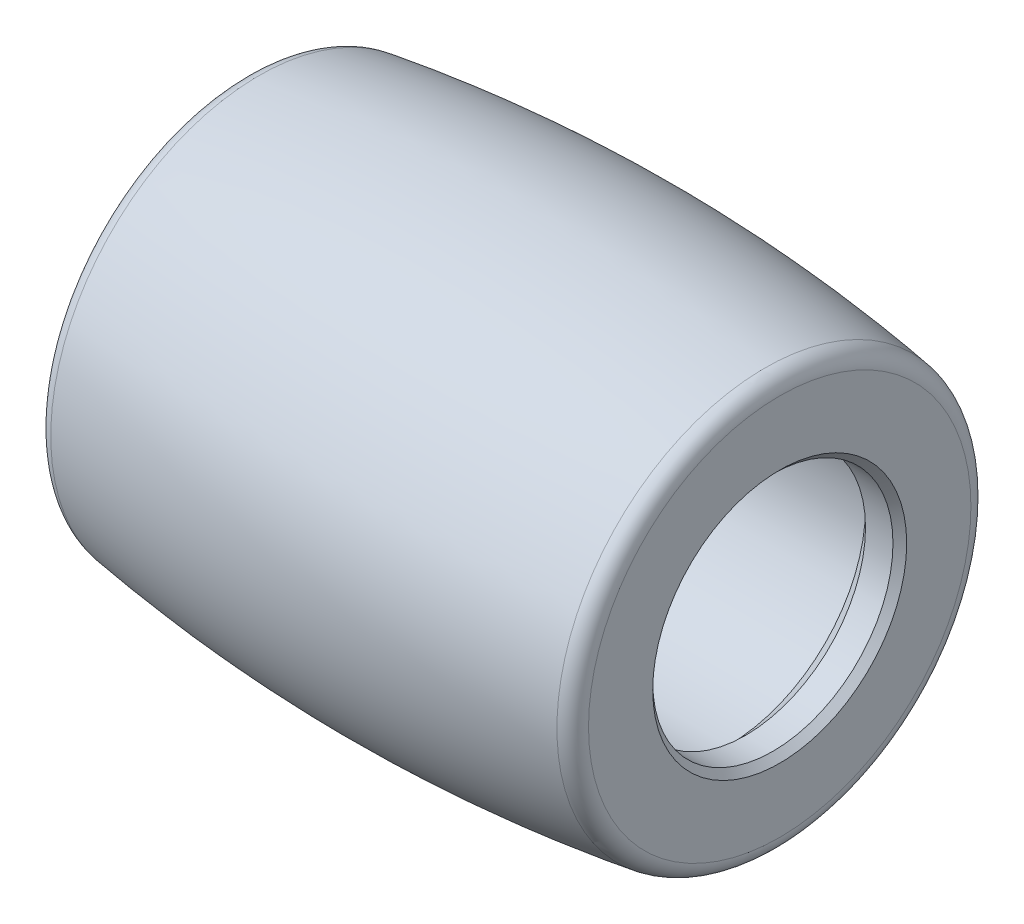
ISO-10303-21;
HEADER;
FILE_DESCRIPTION(('STEP AP214'),'2;1');
FILE_NAME('part.step','',(''),(''),'','','');
FILE_SCHEMA(('AUTOMOTIVE_DESIGN { 1 0 10303 214 1 1 1 1 }'));
ENDSEC;
DATA;
#1=APPLICATION_CONTEXT('core data for automotive mechanical design processes');
#2=APPLICATION_PROTOCOL_DEFINITION('international standard','automotive_design',2000,#1);
#3=PRODUCT_CONTEXT('',#1,'mechanical');
#4=PRODUCT('Part','Part','',(#3));
#5=PRODUCT_RELATED_PRODUCT_CATEGORY('part','',(#4));
#6=PRODUCT_DEFINITION_FORMATION('','',#4);
#7=PRODUCT_DEFINITION_CONTEXT('part definition',#1,'design');
#8=PRODUCT_DEFINITION('design','',#6,#7);
#9=PRODUCT_DEFINITION_SHAPE('','',#8);
#10=(LENGTH_UNIT() NAMED_UNIT(*) SI_UNIT(.MILLI.,.METRE.));
#11=(NAMED_UNIT(*) PLANE_ANGLE_UNIT() SI_UNIT($,.RADIAN.));
#12=(NAMED_UNIT(*) SI_UNIT($,.STERADIAN.) SOLID_ANGLE_UNIT());
#13=UNCERTAINTY_MEASURE_WITH_UNIT(LENGTH_MEASURE(1.E-05),#10,'distance_accuracy_value','');
#14=(GEOMETRIC_REPRESENTATION_CONTEXT(3) GLOBAL_UNCERTAINTY_ASSIGNED_CONTEXT((#13)) GLOBAL_UNIT_ASSIGNED_CONTEXT((#10,
#11,#12)) REPRESENTATION_CONTEXT('',''));
#15=CARTESIAN_POINT('',(0.,0.,0.));
#16=DIRECTION('',(0.,0.,1.));
#17=DIRECTION('',(1.,0.,0.));
#18=AXIS2_PLACEMENT_3D('',#15,#16,#17);
#19=CARTESIAN_POINT('',(-7.8,0.,0.));
#20=DIRECTION('',(-1.,0.,0.));
#21=DIRECTION('',(0.,0.,1.));
#22=AXIS2_PLACEMENT_3D('',#19,#20,#21);
#23=CYLINDRICAL_SURFACE('',#22,4.);
#24=CARTESIAN_POINT('',(6.29999999995334,0.,0.));
#25=DIRECTION('',(-1.,0.,0.));
#26=DIRECTION('',(0.,0.,1.));
#27=AXIS2_PLACEMENT_3D('',#24,#25,#26);
#28=CIRCLE('',#27,3.99999999996226);
#29=CARTESIAN_POINT('',(6.29999999995334,0.,3.99999999996226));
#30=VERTEX_POINT('',#29);
#31=EDGE_CURVE('E85',#30,#30,#28,.F.);
#32=ORIENTED_EDGE('',*,*,#31,.T.);
#33=EDGE_LOOP('',(#32));
#34=FACE_BOUND('',#33,.T.);
#35=CARTESIAN_POINT('',(-6.29999999995334,0.,0.));
#36=DIRECTION('',(1.,0.,0.));
#37=DIRECTION('',(0.,0.,-1.));
#38=AXIS2_PLACEMENT_3D('',#35,#36,#37);
#39=CIRCLE('',#38,3.99999999996226);
#40=CARTESIAN_POINT('',(-6.29999999995334,0.,-3.99999999996226));
#41=VERTEX_POINT('',#40);
#42=EDGE_CURVE('E58',#41,#41,#39,.F.);
#43=ORIENTED_EDGE('',*,*,#42,.T.);
#44=EDGE_LOOP('',(#43));
#45=FACE_BOUND('',#44,.T.);
#46=ADVANCED_FACE('F16',(#34,#45),#23,.F.);
#47=CARTESIAN_POINT('',(-6.29999999995334,0.,0.));
#48=DIRECTION('',(1.,0.,0.));
#49=DIRECTION('',(0.,0.,-1.));
#50=AXIS2_PLACEMENT_3D('',#47,#48,#49);
#51=CONICAL_SURFACE('',#50,3.99999999996226,0.785398163340605);
#52=CARTESIAN_POINT('',(-6.8,0.,0.));
#53=DIRECTION('',(1.,0.,0.));
#54=DIRECTION('',(0.,0.,-1.));
#55=AXIS2_PLACEMENT_3D('',#52,#53,#54);
#56=CIRCLE('',#55,3.5);
#57=CARTESIAN_POINT('',(-6.8,0.,-3.5));
#58=VERTEX_POINT('',#57);
#59=EDGE_CURVE('E82',#58,#58,#56,.F.);
#60=ORIENTED_EDGE('',*,*,#59,.T.);
#61=EDGE_LOOP('',(#60));
#62=FACE_BOUND('',#61,.T.);
#63=ORIENTED_EDGE('',*,*,#42,.F.);
#64=EDGE_LOOP('',(#63));
#65=FACE_BOUND('',#64,.T.);
#66=ADVANCED_FACE('F95',(#62,#65),#51,.F.);
#67=CARTESIAN_POINT('',(6.29999999995334,0.,0.));
#68=DIRECTION('',(-1.,0.,0.));
#69=DIRECTION('',(0.,0.,1.));
#70=AXIS2_PLACEMENT_3D('',#67,#68,#69);
#71=CONICAL_SURFACE('',#70,3.99999999996226,0.785398163340605);
#72=CARTESIAN_POINT('',(6.8,0.,0.));
#73=DIRECTION('',(1.,0.,0.));
#74=DIRECTION('',(0.,0.,-1.));
#75=AXIS2_PLACEMENT_3D('',#72,#73,#74);
#76=CIRCLE('',#75,3.5);
#77=CARTESIAN_POINT('',(6.8,0.,-3.5));
#78=VERTEX_POINT('',#77);
#79=EDGE_CURVE('E75',#78,#78,#76,.T.);
#80=ORIENTED_EDGE('',*,*,#79,.T.);
#81=EDGE_LOOP('',(#80));
#82=FACE_BOUND('',#81,.T.);
#83=ORIENTED_EDGE('',*,*,#31,.F.);
#84=EDGE_LOOP('',(#83));
#85=FACE_BOUND('',#84,.T.);
#86=ADVANCED_FACE('F97',(#82,#85),#71,.F.);
#87=CARTESIAN_POINT('',(-7.8,0.,0.));
#88=DIRECTION('',(1.,0.,0.));
#89=DIRECTION('',(0.,0.,-1.));
#90=AXIS2_PLACEMENT_3D('',#87,#88,#89);
#91=CYLINDRICAL_SURFACE('',#90,3.5);
#92=CARTESIAN_POINT('',(-7.60000000002492,0.,0.));
#93=DIRECTION('',(-1.,0.,0.));
#94=DIRECTION('',(0.,0.,1.));
#95=AXIS2_PLACEMENT_3D('',#92,#93,#94);
#96=CIRCLE('',#95,3.50000000003092);
#97=CARTESIAN_POINT('',(-7.60000000002492,0.,3.50000000003092));
#98=VERTEX_POINT('',#97);
#99=EDGE_CURVE('E70',#98,#98,#96,.T.);
#100=ORIENTED_EDGE('',*,*,#99,.T.);
#101=EDGE_LOOP('',(#100));
#102=FACE_BOUND('',#101,.T.);
#103=ORIENTED_EDGE('',*,*,#59,.F.);
#104=EDGE_LOOP('',(#103));
#105=FACE_BOUND('',#104,.T.);
#106=ADVANCED_FACE('F105',(#102,#105),#91,.F.);
#107=CARTESIAN_POINT('',(7.8,0.,0.));
#108=DIRECTION('',(1.,0.,0.));
#109=DIRECTION('',(0.,0.,-1.));
#110=AXIS2_PLACEMENT_3D('',#107,#108,#109);
#111=CYLINDRICAL_SURFACE('',#110,3.5);
#112=ORIENTED_EDGE('',*,*,#79,.F.);
#113=EDGE_LOOP('',(#112));
#114=FACE_BOUND('',#113,.T.);
#115=CARTESIAN_POINT('',(7.60000000002492,0.,0.));
#116=DIRECTION('',(1.,0.,0.));
#117=DIRECTION('',(0.,0.,-1.));
#118=AXIS2_PLACEMENT_3D('',#115,#116,#117);
#119=CIRCLE('',#118,3.50000000003092);
#120=CARTESIAN_POINT('',(7.60000000002492,0.,-3.50000000003092));
#121=VERTEX_POINT('',#120);
#122=EDGE_CURVE('E65',#121,#121,#119,.T.);
#123=ORIENTED_EDGE('',*,*,#122,.T.);
#124=EDGE_LOOP('',(#123));
#125=FACE_BOUND('',#124,.T.);
#126=ADVANCED_FACE('F136',(#114,#125),#111,.F.);
#127=CARTESIAN_POINT('',(-7.79999999991787,0.,0.));
#128=DIRECTION('',(-1.,0.,0.));
#129=DIRECTION('',(0.,0.,1.));
#130=AXIS2_PLACEMENT_3D('',#127,#128,#129);
#131=CONICAL_SURFACE('',#130,3.69999999992388,0.785398163397448);
#132=ORIENTED_EDGE('',*,*,#99,.F.);
#133=EDGE_LOOP('',(#132));
#134=FACE_BOUND('',#133,.T.);
#135=CARTESIAN_POINT('',(-7.79999999997472,0.,0.));
#136=DIRECTION('',(-1.,0.,0.));
#137=DIRECTION('',(0.,0.,1.));
#138=AXIS2_PLACEMENT_3D('',#135,#136,#137);
#139=CIRCLE('',#138,3.69999999998072);
#140=CARTESIAN_POINT('',(-7.79999999997472,0.,3.69999999998072));
#141=VERTEX_POINT('',#140);
#142=EDGE_CURVE('E20',#141,#141,#139,.T.);
#143=ORIENTED_EDGE('',*,*,#142,.T.);
#144=EDGE_LOOP('',(#143));
#145=FACE_BOUND('',#144,.T.);
#146=ADVANCED_FACE('F132',(#134,#145),#131,.F.);
#147=CARTESIAN_POINT('',(7.79999999991787,0.,0.));
#148=DIRECTION('',(1.,0.,0.));
#149=DIRECTION('',(0.,0.,-1.));
#150=AXIS2_PLACEMENT_3D('',#147,#148,#149);
#151=CONICAL_SURFACE('',#150,3.69999999992388,0.785398163397448);
#152=ORIENTED_EDGE('',*,*,#122,.F.);
#153=EDGE_LOOP('',(#152));
#154=FACE_BOUND('',#153,.T.);
#155=CARTESIAN_POINT('',(7.79999999997472,0.,0.));
#156=DIRECTION('',(1.,0.,0.));
#157=DIRECTION('',(0.,0.,-1.));
#158=AXIS2_PLACEMENT_3D('',#155,#156,#157);
#159=CIRCLE('',#158,3.69999999998072);
#160=CARTESIAN_POINT('',(7.79999999997472,0.,-3.69999999998072));
#161=VERTEX_POINT('',#160);
#162=EDGE_CURVE('E42',#161,#161,#159,.F.);
#163=ORIENTED_EDGE('',*,*,#162,.F.);
#164=EDGE_LOOP('',(#163));
#165=FACE_BOUND('',#164,.T.);
#166=ADVANCED_FACE('F128',(#154,#165),#151,.F.);
#167=CARTESIAN_POINT('',(-7.8,0.,0.));
#168=DIRECTION('',(1.,0.,0.));
#169=DIRECTION('',(0.,0.,-1.));
#170=AXIS2_PLACEMENT_3D('',#167,#168,#169);
#171=PLANE('',#170);
#172=CARTESIAN_POINT('',(-7.79999999999449,0.,0.));
#173=DIRECTION('',(1.,0.,0.));
#174=DIRECTION('',(0.,0.,-1.));
#175=AXIS2_PLACEMENT_3D('',#172,#173,#174);
#176=CIRCLE('',#175,5.57090774301135);
#177=CARTESIAN_POINT('',(-7.7999999999945,0.,-5.57090774301135));
#178=VERTEX_POINT('',#177);
#179=EDGE_CURVE('E41',#178,#178,#176,.T.);
#180=ORIENTED_EDGE('',*,*,#179,.F.);
#181=EDGE_LOOP('',(#180));
#182=FACE_BOUND('',#181,.T.);
#183=ORIENTED_EDGE('',*,*,#142,.F.);
#184=EDGE_LOOP('',(#183));
#185=FACE_BOUND('',#184,.T.);
#186=ADVANCED_FACE('F125',(#182,#185),#171,.F.);
#187=CARTESIAN_POINT('',(7.8,0.,0.));
#188=DIRECTION('',(1.,0.,0.));
#189=DIRECTION('',(0.,0.,-1.));
#190=AXIS2_PLACEMENT_3D('',#187,#188,#189);
#191=PLANE('',#190);
#192=CARTESIAN_POINT('',(7.8,0.,0.));
#193=DIRECTION('',(1.,0.,0.));
#194=DIRECTION('',(0.,0.,-1.));
#195=AXIS2_PLACEMENT_3D('',#192,#193,#194);
#196=CIRCLE('',#195,5.570905317122);
#197=CARTESIAN_POINT('',(7.8,-5.570905317122,-2.89578609572252E-11));
#198=VERTEX_POINT('',#197);
#199=CARTESIAN_POINT('',(7.8,-5.57051217530674,-0.0662360816136397));
#200=VERTEX_POINT('',#199);
#201=EDGE_CURVE('E36',#198,#200,#196,.F.);
#202=ORIENTED_EDGE('',*,*,#201,.F.);
#203=DIRECTION('',(0.,0.00592639088267769,-0.999982438791355));
#204=VECTOR('',#203,1.);
#205=CARTESIAN_POINT('',(7.8,-5.570905317122,-2.90237152677025E-11));
#206=LINE('',#205,#204);
#207=EDGE_CURVE('E38',#198,#200,#206,.T.);
#208=ORIENTED_EDGE('',*,*,#207,.T.);
#209=EDGE_LOOP('',(#202,#208));
#210=FACE_BOUND('',#209,.T.);
#211=ORIENTED_EDGE('',*,*,#162,.T.);
#212=EDGE_LOOP('',(#211));
#213=FACE_BOUND('',#212,.T.);
#214=ADVANCED_FACE('F44',(#210,#213),#191,.T.);
#215=CARTESIAN_POINT('',(-7.3,0.,0.));
#216=DIRECTION('',(1.,0.,0.));
#217=DIRECTION('',(0.,0.,-1.));
#218=AXIS2_PLACEMENT_3D('',#215,#216,#217);
#219=TOROIDAL_SURFACE('',#218,5.57090539665,0.500000000000002);
#220=CARTESIAN_POINT('',(-7.37373740775296,0.,-1.35308431126191E-13));
#221=DIRECTION('',(1.,0.,0.));
#222=DIRECTION('',(0.,0.,-1.));
#223=AXIS2_PLACEMENT_3D('',#220,#221,#222);
#224=CIRCLE('',#223,6.06543830222605);
#225=CARTESIAN_POINT('',(-7.37373740775296,0.,-6.06543830222618));
#226=VERTEX_POINT('',#225);
#227=EDGE_CURVE('E26',#226,#226,#224,.T.);
#228=ORIENTED_EDGE('',*,*,#227,.F.);
#229=EDGE_LOOP('',(#228));
#230=FACE_BOUND('',#229,.T.);
#231=ORIENTED_EDGE('',*,*,#179,.T.);
#232=EDGE_LOOP('',(#231));
#233=FACE_BOUND('',#232,.T.);
#234=ADVANCED_FACE('F117',(#230,#233),#219,.T.);
#235=CARTESIAN_POINT('',(7.3,0.,0.));
#236=DIRECTION('',(1.,0.,0.));
#237=DIRECTION('',(0.,0.,-1.));
#238=AXIS2_PLACEMENT_3D('',#235,#236,#237);
#239=TOROIDAL_SURFACE('',#238,5.57090539665,0.500000000000004);
#240=CARTESIAN_POINT('',(7.37373739217235,0.,-1.35308431126191E-13));
#241=DIRECTION('',(1.,0.,0.));
#242=DIRECTION('',(0.,0.,-1.));
#243=AXIS2_PLACEMENT_3D('',#240,#241,#242);
#244=CIRCLE('',#243,6.06543830454967);
#245=CARTESIAN_POINT('',(7.37373739217235,0.,-6.0654383045498));
#246=VERTEX_POINT('',#245);
#247=EDGE_CURVE('E11',#246,#246,#244,.F.);
#248=ORIENTED_EDGE('',*,*,#247,.F.);
#249=EDGE_LOOP('',(#248));
#250=FACE_BOUND('',#249,.T.);
#251=ORIENTED_EDGE('',*,*,#201,.T.);
#252=ORIENTED_EDGE('',*,*,#207,.F.);
#253=EDGE_LOOP('',(#251,#252));
#254=FACE_BOUND('',#253,.T.);
#255=ADVANCED_FACE('F18',(#250,#254),#239,.T.);
#256=CARTESIAN_POINT('',(1.57903204400789E-12,0.,43.3878527575467));
#257=DIRECTION('',(0.,1.,0.));
#258=DIRECTION('',(0.,0.,-1.));
#259=AXIS2_PLACEMENT_3D('',#256,#257,#258);
#260=CIRCLE('',#259,50.0000000000113);
#261=TRIMMED_CURVE('',#260,(PARAMETER_VALUE(-0.520125015553683)),
(PARAMETER_VALUE(0.520125015553683)),.T.,.PARAMETER.);
#262=CARTESIAN_POINT('',(1.57903204400789E-12,0.,-1.35308431126191E-13));
#263=DIRECTION('',(1.,0.,0.));
#264=AXIS1_PLACEMENT('',#262,#263);
#265=SURFACE_OF_REVOLUTION('',#261,#264);
#266=ORIENTED_EDGE('',*,*,#227,.T.);
#267=EDGE_LOOP('',(#266));
#268=FACE_BOUND('',#267,.T.);
#269=ORIENTED_EDGE('',*,*,#247,.T.);
#270=EDGE_LOOP('',(#269));
#271=FACE_BOUND('',#270,.T.);
#272=ADVANCED_FACE('F110',(#268,#271),#265,.F.);
#273=CLOSED_SHELL('',(#46,#66,#86,#106,#126,#146,#166,#186,#214,#234,#255,#272));
#274=MANIFOLD_SOLID_BREP('B1',#273);
#275=ADVANCED_BREP_SHAPE_REPRESENTATION('',(#18,#274),#14);
#276=SHAPE_DEFINITION_REPRESENTATION(#9,#275);
ENDSEC;
END-ISO-10303-21;
